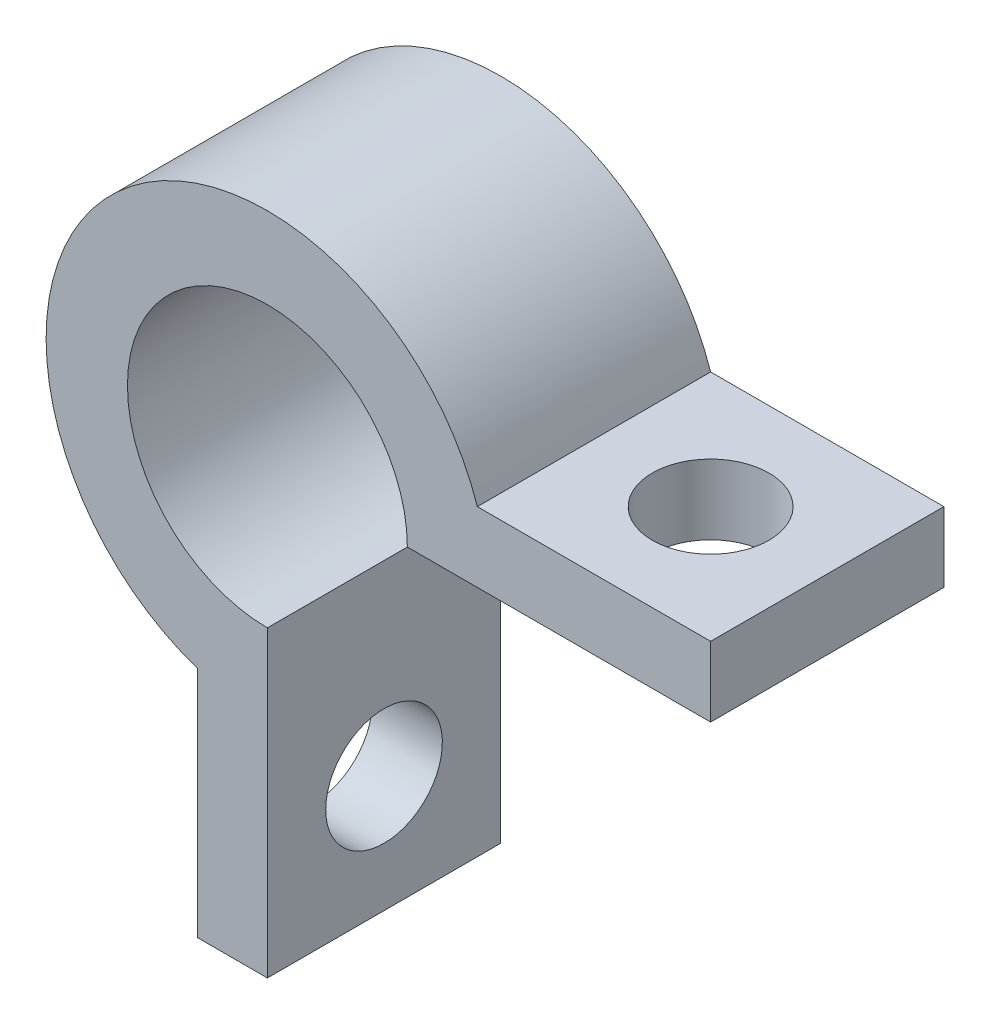
ISO-10303-21;
HEADER;
FILE_DESCRIPTION(('STEP AP214'),'2;1');
FILE_NAME('part.step','',(''),(''),'','','');
FILE_SCHEMA(('AUTOMOTIVE_DESIGN { 1 0 10303 214 1 1 1 1 }'));
ENDSEC;
DATA;
#1=APPLICATION_CONTEXT('core data for automotive mechanical design processes');
#2=APPLICATION_PROTOCOL_DEFINITION('international standard','automotive_design',2000,#1);
#3=PRODUCT_CONTEXT('',#1,'mechanical');
#4=PRODUCT('Part','Part','',(#3));
#5=PRODUCT_RELATED_PRODUCT_CATEGORY('part','',(#4));
#6=PRODUCT_DEFINITION_FORMATION('','',#4);
#7=PRODUCT_DEFINITION_CONTEXT('part definition',#1,'design');
#8=PRODUCT_DEFINITION('design','',#6,#7);
#9=PRODUCT_DEFINITION_SHAPE('','',#8);
#10=(LENGTH_UNIT() NAMED_UNIT(*) SI_UNIT(.MILLI.,.METRE.));
#11=(NAMED_UNIT(*) PLANE_ANGLE_UNIT() SI_UNIT($,.RADIAN.));
#12=(NAMED_UNIT(*) SI_UNIT($,.STERADIAN.) SOLID_ANGLE_UNIT());
#13=UNCERTAINTY_MEASURE_WITH_UNIT(LENGTH_MEASURE(1.E-05),#10,'distance_accuracy_value','');
#14=(GEOMETRIC_REPRESENTATION_CONTEXT(3) GLOBAL_UNCERTAINTY_ASSIGNED_CONTEXT((#13)) GLOBAL_UNIT_ASSIGNED_CONTEXT((#10,
#11,#12)) REPRESENTATION_CONTEXT('',''));
#15=CARTESIAN_POINT('',(0.,0.,0.));
#16=DIRECTION('',(0.,0.,1.));
#17=DIRECTION('',(1.,0.,0.));
#18=AXIS2_PLACEMENT_3D('',#15,#16,#17);
#19=CARTESIAN_POINT('',(0.,7.62,12.7));
#20=DIRECTION('',(0.,0.,-1.));
#21=DIRECTION('',(-1.,0.,0.));
#22=AXIS2_PLACEMENT_3D('',#19,#20,#21);
#23=CYLINDRICAL_SURFACE('',#22,7.62);
#24=CARTESIAN_POINT('',(0.,7.62,0.));
#25=DIRECTION('',(0.,0.,-1.));
#26=DIRECTION('',(-1.,0.,0.));
#27=AXIS2_PLACEMENT_3D('',#24,#25,#26);
#28=CIRCLE('',#27,7.62);
#29=CARTESIAN_POINT('',(0.,0.,0.));
#30=VERTEX_POINT('',#29);
#31=CARTESIAN_POINT('',(7.62,7.62,0.));
#32=VERTEX_POINT('',#31);
#33=EDGE_CURVE('E136',#30,#32,#28,.T.);
#34=ORIENTED_EDGE('',*,*,#33,.T.);
#35=DIRECTION('',(0.,0.,-1.));
#36=VECTOR('',#35,1.);
#37=CARTESIAN_POINT('',(7.62,7.62,12.7));
#38=LINE('',#37,#36);
#39=CARTESIAN_POINT('',(7.62,7.62,12.7));
#40=VERTEX_POINT('',#39);
#41=EDGE_CURVE('E11',#40,#32,#38,.T.);
#42=ORIENTED_EDGE('',*,*,#41,.F.);
#43=CARTESIAN_POINT('',(0.,7.62,12.7));
#44=DIRECTION('',(0.,0.,-1.));
#45=DIRECTION('',(-1.,0.,0.));
#46=AXIS2_PLACEMENT_3D('',#43,#44,#45);
#47=CIRCLE('',#46,7.62);
#48=CARTESIAN_POINT('',(0.,0.,12.7));
#49=VERTEX_POINT('',#48);
#50=EDGE_CURVE('E151',#49,#40,#47,.T.);
#51=ORIENTED_EDGE('',*,*,#50,.F.);
#52=DIRECTION('',(0.,0.,-1.));
#53=VECTOR('',#52,1.);
#54=CARTESIAN_POINT('',(0.,0.,12.7));
#55=LINE('',#54,#53);
#56=EDGE_CURVE('E132',#49,#30,#55,.T.);
#57=ORIENTED_EDGE('',*,*,#56,.T.);
#58=EDGE_LOOP('',(#34,#42,#51,#57));
#59=FACE_BOUND('',#58,.T.);
#60=ADVANCED_FACE('F39',(#59),#23,.F.);
#61=CARTESIAN_POINT('',(7.62,7.62,12.7));
#62=DIRECTION('',(0.,1.,0.));
#63=DIRECTION('',(0.,0.,1.));
#64=AXIS2_PLACEMENT_3D('',#61,#62,#63);
#65=PLANE('',#64);
#66=CARTESIAN_POINT('',(17.78,7.62,6.35));
#67=DIRECTION('',(0.,1.,0.));
#68=DIRECTION('',(0.,0.,1.));
#69=AXIS2_PLACEMENT_3D('',#66,#67,#68);
#70=CIRCLE('',#69,3.175);
#71=CARTESIAN_POINT('',(17.78,7.62,9.525));
#72=VERTEX_POINT('',#71);
#73=EDGE_CURVE('E140',#72,#72,#70,.T.);
#74=ORIENTED_EDGE('',*,*,#73,.T.);
#75=EDGE_LOOP('',(#74));
#76=FACE_BOUND('',#75,.T.);
#77=DIRECTION('',(1.,0.,0.));
#78=VECTOR('',#77,1.);
#79=CARTESIAN_POINT('',(7.62,7.62,0.));
#80=LINE('',#79,#78);
#81=CARTESIAN_POINT('',(24.13,7.62,0.));
#82=VERTEX_POINT('',#81);
#83=EDGE_CURVE('E139',#32,#82,#80,.T.);
#84=ORIENTED_EDGE('',*,*,#83,.T.);
#85=DIRECTION('',(0.,0.,-1.));
#86=VECTOR('',#85,1.);
#87=CARTESIAN_POINT('',(24.13,7.62,12.7));
#88=LINE('',#87,#86);
#89=CARTESIAN_POINT('',(24.13,7.62,12.7));
#90=VERTEX_POINT('',#89);
#91=EDGE_CURVE('E48',#90,#82,#88,.T.);
#92=ORIENTED_EDGE('',*,*,#91,.F.);
#93=DIRECTION('',(1.,0.,0.));
#94=VECTOR('',#93,1.);
#95=CARTESIAN_POINT('',(7.62,7.62,12.7));
#96=LINE('',#95,#94);
#97=EDGE_CURVE('E99',#40,#90,#96,.T.);
#98=ORIENTED_EDGE('',*,*,#97,.F.);
#99=ORIENTED_EDGE('',*,*,#41,.T.);
#100=EDGE_LOOP('',(#84,#92,#98,#99));
#101=FACE_BOUND('',#100,.T.);
#102=ADVANCED_FACE('F210',(#76,#101),#65,.F.);
#103=CARTESIAN_POINT('',(24.13,7.62,12.7));
#104=DIRECTION('',(-1.,0.,0.));
#105=DIRECTION('',(0.,0.,1.));
#106=AXIS2_PLACEMENT_3D('',#103,#104,#105);
#107=PLANE('',#106);
#108=DIRECTION('',(0.,1.,0.));
#109=VECTOR('',#108,1.);
#110=CARTESIAN_POINT('',(24.13,7.62,0.));
#111=LINE('',#110,#109);
#112=CARTESIAN_POINT('',(24.13,11.43,0.));
#113=VERTEX_POINT('',#112);
#114=EDGE_CURVE('E142',#82,#113,#111,.T.);
#115=ORIENTED_EDGE('',*,*,#114,.T.);
#116=DIRECTION('',(0.,0.,-1.));
#117=VECTOR('',#116,1.);
#118=CARTESIAN_POINT('',(24.13,11.43,12.7));
#119=LINE('',#118,#117);
#120=CARTESIAN_POINT('',(24.13,11.43,12.7));
#121=VERTEX_POINT('',#120);
#122=EDGE_CURVE('E158',#121,#113,#119,.T.);
#123=ORIENTED_EDGE('',*,*,#122,.F.);
#124=DIRECTION('',(0.,1.,0.));
#125=VECTOR('',#124,1.);
#126=CARTESIAN_POINT('',(24.13,7.62,12.7));
#127=LINE('',#126,#125);
#128=EDGE_CURVE('E167',#90,#121,#127,.T.);
#129=ORIENTED_EDGE('',*,*,#128,.F.);
#130=ORIENTED_EDGE('',*,*,#91,.T.);
#131=EDGE_LOOP('',(#115,#123,#129,#130));
#132=FACE_BOUND('',#131,.T.);
#133=ADVANCED_FACE('F165',(#132),#107,.F.);
#134=CARTESIAN_POINT('',(24.13,11.43,12.7));
#135=DIRECTION('',(0.,-1.,0.));
#136=DIRECTION('',(0.,0.,-1.));
#137=AXIS2_PLACEMENT_3D('',#134,#135,#136);
#138=PLANE('',#137);
#139=CARTESIAN_POINT('',(17.78,11.43,6.35));
#140=DIRECTION('',(0.,1.,0.));
#141=DIRECTION('',(0.,0.,1.));
#142=AXIS2_PLACEMENT_3D('',#139,#140,#141);
#143=CIRCLE('',#142,3.175);
#144=CARTESIAN_POINT('',(17.78,11.43,9.525));
#145=VERTEX_POINT('',#144);
#146=EDGE_CURVE('E187',#145,#145,#143,.T.);
#147=ORIENTED_EDGE('',*,*,#146,.F.);
#148=EDGE_LOOP('',(#147));
#149=FACE_BOUND('',#148,.T.);
#150=DIRECTION('',(-1.,0.,0.));
#151=VECTOR('',#150,1.);
#152=CARTESIAN_POINT('',(24.13,11.43,0.));
#153=LINE('',#152,#151);
#154=CARTESIAN_POINT('',(11.43,11.43,0.));
#155=VERTEX_POINT('',#154);
#156=EDGE_CURVE('E144',#113,#155,#153,.T.);
#157=ORIENTED_EDGE('',*,*,#156,.T.);
#158=DIRECTION('',(0.,0.,-1.));
#159=VECTOR('',#158,1.);
#160=CARTESIAN_POINT('',(11.43,11.43,12.7));
#161=LINE('',#160,#159);
#162=CARTESIAN_POINT('',(11.43,11.43,12.7));
#163=VERTEX_POINT('',#162);
#164=EDGE_CURVE('E155',#163,#155,#161,.T.);
#165=ORIENTED_EDGE('',*,*,#164,.F.);
#166=DIRECTION('',(-1.,0.,0.));
#167=VECTOR('',#166,1.);
#168=CARTESIAN_POINT('',(24.13,11.43,12.7));
#169=LINE('',#168,#167);
#170=EDGE_CURVE('E179',#121,#163,#169,.T.);
#171=ORIENTED_EDGE('',*,*,#170,.F.);
#172=ORIENTED_EDGE('',*,*,#122,.T.);
#173=EDGE_LOOP('',(#157,#165,#171,#172));
#174=FACE_BOUND('',#173,.T.);
#175=ADVANCED_FACE('F175',(#149,#174),#138,.F.);
#176=CARTESIAN_POINT('',(0.,7.62,12.7));
#177=DIRECTION('',(0.,0.,-1.));
#178=DIRECTION('',(-1.,0.,0.));
#179=AXIS2_PLACEMENT_3D('',#176,#177,#178);
#180=CYLINDRICAL_SURFACE('',#179,12.0482778852415);
#181=CARTESIAN_POINT('',(0.,7.62,0.));
#182=DIRECTION('',(0.,0.,1.));
#183=DIRECTION('',(-1.,0.,0.));
#184=AXIS2_PLACEMENT_3D('',#181,#182,#183);
#185=CIRCLE('',#184,12.0482778852415);
#186=CARTESIAN_POINT('',(-3.81,-3.81,0.));
#187=VERTEX_POINT('',#186);
#188=EDGE_CURVE('E146',#155,#187,#185,.T.);
#189=ORIENTED_EDGE('',*,*,#188,.T.);
#190=DIRECTION('',(0.,0.,-1.));
#191=VECTOR('',#190,1.);
#192=CARTESIAN_POINT('',(-3.81,-3.81,12.7));
#193=LINE('',#192,#191);
#194=CARTESIAN_POINT('',(-3.81,-3.81,12.7));
#195=VERTEX_POINT('',#194);
#196=EDGE_CURVE('E127',#195,#187,#193,.T.);
#197=ORIENTED_EDGE('',*,*,#196,.F.);
#198=CARTESIAN_POINT('',(0.,7.62,12.7));
#199=DIRECTION('',(0.,0.,1.));
#200=DIRECTION('',(-1.,0.,0.));
#201=AXIS2_PLACEMENT_3D('',#198,#199,#200);
#202=CIRCLE('',#201,12.0482778852415);
#203=EDGE_CURVE('E118',#163,#195,#202,.T.);
#204=ORIENTED_EDGE('',*,*,#203,.F.);
#205=ORIENTED_EDGE('',*,*,#164,.T.);
#206=EDGE_LOOP('',(#189,#197,#204,#205));
#207=FACE_BOUND('',#206,.T.);
#208=ADVANCED_FACE('F178',(#207),#180,.T.);
#209=CARTESIAN_POINT('',(-3.81,-3.81,12.7));
#210=DIRECTION('',(1.,0.,0.));
#211=DIRECTION('',(0.,0.,-1.));
#212=AXIS2_PLACEMENT_3D('',#209,#210,#211);
#213=PLANE('',#212);
#214=CARTESIAN_POINT('',(-3.81,-10.16,6.35));
#215=DIRECTION('',(-1.,0.,0.));
#216=DIRECTION('',(0.,0.,1.));
#217=AXIS2_PLACEMENT_3D('',#214,#215,#216);
#218=CIRCLE('',#217,3.175);
#219=CARTESIAN_POINT('',(-3.81,-10.16,9.525));
#220=VERTEX_POINT('',#219);
#221=EDGE_CURVE('E190',#220,#220,#218,.T.);
#222=ORIENTED_EDGE('',*,*,#221,.F.);
#223=EDGE_LOOP('',(#222));
#224=FACE_BOUND('',#223,.T.);
#225=DIRECTION('',(0.,-1.,0.));
#226=VECTOR('',#225,1.);
#227=CARTESIAN_POINT('',(-3.81,-3.81,0.));
#228=LINE('',#227,#226);
#229=CARTESIAN_POINT('',(-3.81,-16.51,0.));
#230=VERTEX_POINT('',#229);
#231=EDGE_CURVE('E126',#187,#230,#228,.T.);
#232=ORIENTED_EDGE('',*,*,#231,.T.);
#233=DIRECTION('',(0.,0.,-1.));
#234=VECTOR('',#233,1.);
#235=CARTESIAN_POINT('',(-3.81,-16.51,12.7));
#236=LINE('',#235,#234);
#237=CARTESIAN_POINT('',(-3.81,-16.51,12.7));
#238=VERTEX_POINT('',#237);
#239=EDGE_CURVE('E123',#238,#230,#236,.T.);
#240=ORIENTED_EDGE('',*,*,#239,.F.);
#241=DIRECTION('',(0.,-1.,0.));
#242=VECTOR('',#241,1.);
#243=CARTESIAN_POINT('',(-3.81,-3.81,12.7));
#244=LINE('',#243,#242);
#245=EDGE_CURVE('E112',#195,#238,#244,.T.);
#246=ORIENTED_EDGE('',*,*,#245,.F.);
#247=ORIENTED_EDGE('',*,*,#196,.T.);
#248=EDGE_LOOP('',(#232,#240,#246,#247));
#249=FACE_BOUND('',#248,.T.);
#250=ADVANCED_FACE('F124',(#224,#249),#213,.F.);
#251=CARTESIAN_POINT('',(-3.81,-16.51,12.7));
#252=DIRECTION('',(0.,1.,0.));
#253=DIRECTION('',(0.,0.,1.));
#254=AXIS2_PLACEMENT_3D('',#251,#252,#253);
#255=PLANE('',#254);
#256=DIRECTION('',(1.,0.,0.));
#257=VECTOR('',#256,1.);
#258=CARTESIAN_POINT('',(-3.81,-16.51,0.));
#259=LINE('',#258,#257);
#260=CARTESIAN_POINT('',(0.,-16.51,0.));
#261=VERTEX_POINT('',#260);
#262=EDGE_CURVE('E85',#230,#261,#259,.T.);
#263=ORIENTED_EDGE('',*,*,#262,.T.);
#264=DIRECTION('',(0.,0.,-1.));
#265=VECTOR('',#264,1.);
#266=CARTESIAN_POINT('',(0.,-16.51,12.7));
#267=LINE('',#266,#265);
#268=CARTESIAN_POINT('',(0.,-16.51,12.7));
#269=VERTEX_POINT('',#268);
#270=EDGE_CURVE('E128',#269,#261,#267,.T.);
#271=ORIENTED_EDGE('',*,*,#270,.F.);
#272=DIRECTION('',(1.,0.,0.));
#273=VECTOR('',#272,1.);
#274=CARTESIAN_POINT('',(-3.81,-16.51,12.7));
#275=LINE('',#274,#273);
#276=EDGE_CURVE('E116',#238,#269,#275,.T.);
#277=ORIENTED_EDGE('',*,*,#276,.F.);
#278=ORIENTED_EDGE('',*,*,#239,.T.);
#279=EDGE_LOOP('',(#263,#271,#277,#278));
#280=FACE_BOUND('',#279,.T.);
#281=ADVANCED_FACE('F130',(#280),#255,.F.);
#282=CARTESIAN_POINT('',(0.,-16.51,12.7));
#283=DIRECTION('',(-1.,0.,0.));
#284=DIRECTION('',(0.,-1.,0.));
#285=AXIS2_PLACEMENT_3D('',#282,#283,#284);
#286=PLANE('',#285);
#287=CARTESIAN_POINT('',(0.,-10.16,6.35));
#288=DIRECTION('',(-1.,0.,0.));
#289=DIRECTION('',(0.,-1.,0.));
#290=AXIS2_PLACEMENT_3D('',#287,#288,#289);
#291=CIRCLE('',#290,3.175);
#292=CARTESIAN_POINT('',(0.,-13.335,6.35));
#293=VERTEX_POINT('',#292);
#294=EDGE_CURVE('E42',#293,#293,#291,.T.);
#295=ORIENTED_EDGE('',*,*,#294,.T.);
#296=EDGE_LOOP('',(#295));
#297=FACE_BOUND('',#296,.T.);
#298=DIRECTION('',(0.,1.,0.));
#299=VECTOR('',#298,1.);
#300=CARTESIAN_POINT('',(0.,-16.51,0.));
#301=LINE('',#300,#299);
#302=EDGE_CURVE('E91',#261,#30,#301,.T.);
#303=ORIENTED_EDGE('',*,*,#302,.T.);
#304=ORIENTED_EDGE('',*,*,#56,.F.);
#305=DIRECTION('',(0.,1.,0.));
#306=VECTOR('',#305,1.);
#307=CARTESIAN_POINT('',(0.,-16.51,12.7));
#308=LINE('',#307,#306);
#309=EDGE_CURVE('E56',#269,#49,#308,.T.);
#310=ORIENTED_EDGE('',*,*,#309,.F.);
#311=ORIENTED_EDGE('',*,*,#270,.T.);
#312=EDGE_LOOP('',(#303,#304,#310,#311));
#313=FACE_BOUND('',#312,.T.);
#314=ADVANCED_FACE('F197',(#297,#313),#286,.F.);
#315=CARTESIAN_POINT('',(0.,7.62,12.7));
#316=DIRECTION('',(0.,0.,-1.));
#317=DIRECTION('',(-1.,0.,0.));
#318=AXIS2_PLACEMENT_3D('',#315,#316,#317);
#319=PLANE('',#318);
#320=ORIENTED_EDGE('',*,*,#50,.T.);
#321=ORIENTED_EDGE('',*,*,#97,.T.);
#322=ORIENTED_EDGE('',*,*,#128,.T.);
#323=ORIENTED_EDGE('',*,*,#170,.T.);
#324=ORIENTED_EDGE('',*,*,#203,.T.);
#325=ORIENTED_EDGE('',*,*,#245,.T.);
#326=ORIENTED_EDGE('',*,*,#276,.T.);
#327=ORIENTED_EDGE('',*,*,#309,.T.);
#328=EDGE_LOOP('',(#320,#321,#322,#323,#324,#325,#326,#327));
#329=FACE_BOUND('',#328,.T.);
#330=ADVANCED_FACE('F114',(#329),#319,.F.);
#331=CARTESIAN_POINT('',(0.,7.62,0.));
#332=DIRECTION('',(0.,0.,-1.));
#333=DIRECTION('',(-1.,0.,0.));
#334=AXIS2_PLACEMENT_3D('',#331,#332,#333);
#335=PLANE('',#334);
#336=ORIENTED_EDGE('',*,*,#33,.F.);
#337=ORIENTED_EDGE('',*,*,#302,.F.);
#338=ORIENTED_EDGE('',*,*,#262,.F.);
#339=ORIENTED_EDGE('',*,*,#231,.F.);
#340=ORIENTED_EDGE('',*,*,#188,.F.);
#341=ORIENTED_EDGE('',*,*,#156,.F.);
#342=ORIENTED_EDGE('',*,*,#114,.F.);
#343=ORIENTED_EDGE('',*,*,#83,.F.);
#344=EDGE_LOOP('',(#336,#337,#338,#339,#340,#341,#342,#343));
#345=FACE_BOUND('',#344,.T.);
#346=ADVANCED_FACE('F171',(#345),#335,.T.);
#347=CARTESIAN_POINT('',(17.78,-16.51,6.35));
#348=DIRECTION('',(0.,1.,0.));
#349=DIRECTION('',(0.,0.,1.));
#350=AXIS2_PLACEMENT_3D('',#347,#348,#349);
#351=CYLINDRICAL_SURFACE('',#350,3.175);
#352=ORIENTED_EDGE('',*,*,#146,.T.);
#353=EDGE_LOOP('',(#352));
#354=FACE_BOUND('',#353,.T.);
#355=ORIENTED_EDGE('',*,*,#73,.F.);
#356=EDGE_LOOP('',(#355));
#357=FACE_BOUND('',#356,.T.);
#358=ADVANCED_FACE('F201',(#354,#357),#351,.F.);
#359=CARTESIAN_POINT('',(24.13,-10.16,6.35));
#360=DIRECTION('',(-1.,0.,0.));
#361=DIRECTION('',(0.,0.,1.));
#362=AXIS2_PLACEMENT_3D('',#359,#360,#361);
#363=CYLINDRICAL_SURFACE('',#362,3.175);
#364=ORIENTED_EDGE('',*,*,#221,.T.);
#365=EDGE_LOOP('',(#364));
#366=FACE_BOUND('',#365,.T.);
#367=ORIENTED_EDGE('',*,*,#294,.F.);
#368=EDGE_LOOP('',(#367));
#369=FACE_BOUND('',#368,.T.);
#370=ADVANCED_FACE('F199',(#366,#369),#363,.F.);
#371=CLOSED_SHELL('',(#60,#102,#133,#175,#208,#250,#281,#314,#330,#346,#358,#370));
#372=MANIFOLD_SOLID_BREP('B2',#371);
#373=ADVANCED_BREP_SHAPE_REPRESENTATION('',(#18,#372),#14);
#374=SHAPE_DEFINITION_REPRESENTATION(#9,#373);
ENDSEC;
END-ISO-10303-21;
